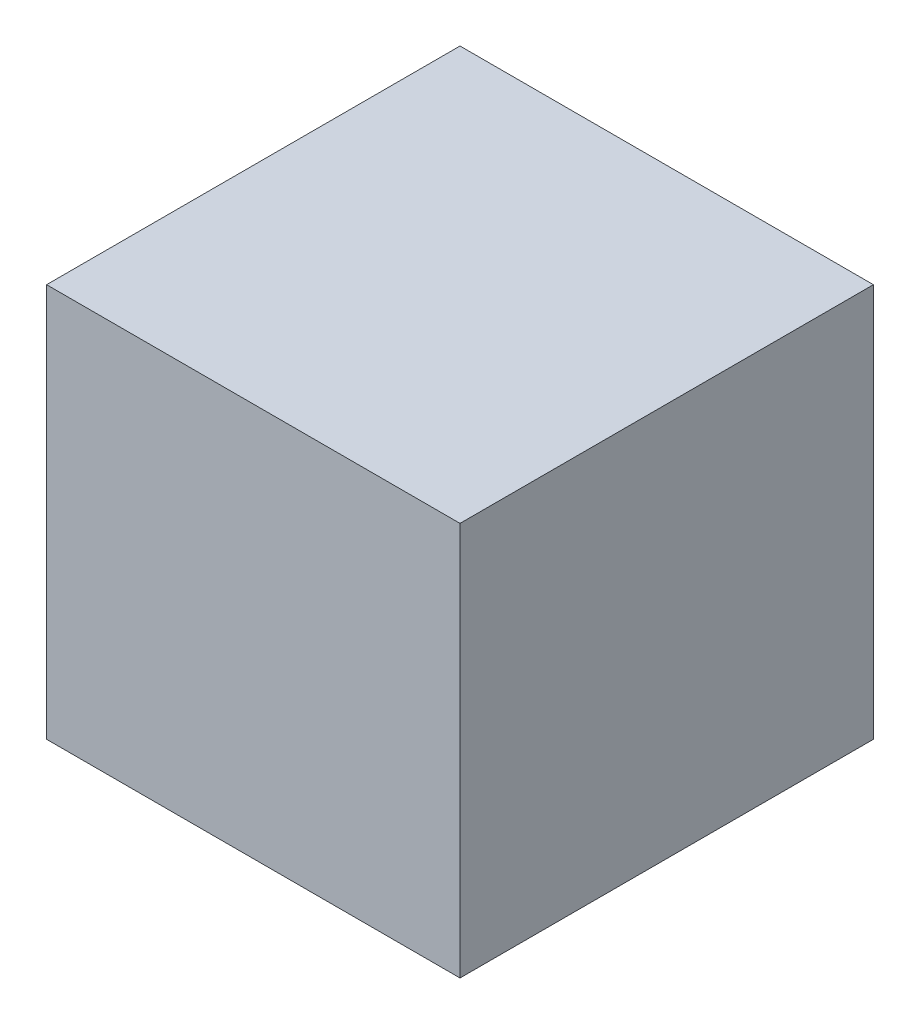
ISO-10303-21;
HEADER;
FILE_DESCRIPTION(('STEP AP214'),'2;1');
FILE_NAME('part.step','',(''),(''),'','','');
FILE_SCHEMA(('AUTOMOTIVE_DESIGN { 1 0 10303 214 1 1 1 1 }'));
ENDSEC;
DATA;
#1=APPLICATION_CONTEXT('core data for automotive mechanical design processes');
#2=APPLICATION_PROTOCOL_DEFINITION('international standard','automotive_design',2000,#1);
#3=PRODUCT_CONTEXT('',#1,'mechanical');
#4=PRODUCT('Part','Part','',(#3));
#5=PRODUCT_RELATED_PRODUCT_CATEGORY('part','',(#4));
#6=PRODUCT_DEFINITION_FORMATION('','',#4);
#7=PRODUCT_DEFINITION_CONTEXT('part definition',#1,'design');
#8=PRODUCT_DEFINITION('design','',#6,#7);
#9=PRODUCT_DEFINITION_SHAPE('','',#8);
#10=(LENGTH_UNIT() NAMED_UNIT(*) SI_UNIT(.MILLI.,.METRE.));
#11=(NAMED_UNIT(*) PLANE_ANGLE_UNIT() SI_UNIT($,.RADIAN.));
#12=(NAMED_UNIT(*) SI_UNIT($,.STERADIAN.) SOLID_ANGLE_UNIT());
#13=UNCERTAINTY_MEASURE_WITH_UNIT(LENGTH_MEASURE(1.E-05),#10,'distance_accuracy_value','');
#14=(GEOMETRIC_REPRESENTATION_CONTEXT(3) GLOBAL_UNCERTAINTY_ASSIGNED_CONTEXT((#13)) GLOBAL_UNIT_ASSIGNED_CONTEXT((#10,
#11,#12)) REPRESENTATION_CONTEXT('',''));
#15=CARTESIAN_POINT('',(0.,0.,0.));
#16=DIRECTION('',(0.,0.,1.));
#17=DIRECTION('',(1.,0.,0.));
#18=AXIS2_PLACEMENT_3D('',#15,#16,#17);
#19=CARTESIAN_POINT('',(0.,40.,0.));
#20=DIRECTION('',(1.,0.,0.));
#21=DIRECTION('',(0.,0.,-1.));
#22=AXIS2_PLACEMENT_3D('',#19,#20,#21);
#23=PLANE('',#22);
#24=DIRECTION('',(0.,0.,1.));
#25=VECTOR('',#24,1.);
#26=CARTESIAN_POINT('',(0.,0.,0.));
#27=LINE('',#26,#25);
#28=CARTESIAN_POINT('',(0.,0.,-42.));
#29=VERTEX_POINT('',#28);
#30=CARTESIAN_POINT('',(0.,0.,0.));
#31=VERTEX_POINT('',#30);
#32=EDGE_CURVE('E113',#29,#31,#27,.T.);
#33=ORIENTED_EDGE('',*,*,#32,.T.);
#34=DIRECTION('',(0.,-1.,0.));
#35=VECTOR('',#34,1.);
#36=CARTESIAN_POINT('',(0.,40.,0.));
#37=LINE('',#36,#35);
#38=CARTESIAN_POINT('',(0.,40.,0.));
#39=VERTEX_POINT('',#38);
#40=EDGE_CURVE('E11',#39,#31,#37,.T.);
#41=ORIENTED_EDGE('',*,*,#40,.F.);
#42=DIRECTION('',(0.,0.,1.));
#43=VECTOR('',#42,1.);
#44=CARTESIAN_POINT('',(0.,40.,0.));
#45=LINE('',#44,#43);
#46=CARTESIAN_POINT('',(0.,40.,-42.));
#47=VERTEX_POINT('',#46);
#48=EDGE_CURVE('E97',#47,#39,#45,.T.);
#49=ORIENTED_EDGE('',*,*,#48,.F.);
#50=DIRECTION('',(0.,-1.,0.));
#51=VECTOR('',#50,1.);
#52=CARTESIAN_POINT('',(0.,40.,-42.));
#53=LINE('',#52,#51);
#54=EDGE_CURVE('E109',#47,#29,#53,.T.);
#55=ORIENTED_EDGE('',*,*,#54,.T.);
#56=EDGE_LOOP('',(#33,#41,#49,#55));
#57=FACE_BOUND('',#56,.T.);
#58=ADVANCED_FACE('F45',(#57),#23,.F.);
#59=CARTESIAN_POINT('',(0.,40.,0.));
#60=DIRECTION('',(0.,0.,-1.));
#61=DIRECTION('',(-1.,0.,0.));
#62=AXIS2_PLACEMENT_3D('',#59,#60,#61);
#63=PLANE('',#62);
#64=DIRECTION('',(1.,0.,0.));
#65=VECTOR('',#64,1.);
#66=CARTESIAN_POINT('',(0.,0.,0.));
#67=LINE('',#66,#65);
#68=CARTESIAN_POINT('',(42.,0.,0.));
#69=VERTEX_POINT('',#68);
#70=EDGE_CURVE('E102',#31,#69,#67,.T.);
#71=ORIENTED_EDGE('',*,*,#70,.T.);
#72=DIRECTION('',(0.,-1.,0.));
#73=VECTOR('',#72,1.);
#74=CARTESIAN_POINT('',(42.,40.,0.));
#75=LINE('',#74,#73);
#76=CARTESIAN_POINT('',(42.,40.,0.));
#77=VERTEX_POINT('',#76);
#78=EDGE_CURVE('E54',#77,#69,#75,.T.);
#79=ORIENTED_EDGE('',*,*,#78,.F.);
#80=DIRECTION('',(1.,0.,0.));
#81=VECTOR('',#80,1.);
#82=CARTESIAN_POINT('',(0.,40.,0.));
#83=LINE('',#82,#81);
#84=EDGE_CURVE('E92',#39,#77,#83,.T.);
#85=ORIENTED_EDGE('',*,*,#84,.F.);
#86=ORIENTED_EDGE('',*,*,#40,.T.);
#87=EDGE_LOOP('',(#71,#79,#85,#86));
#88=FACE_BOUND('',#87,.T.);
#89=ADVANCED_FACE('F101',(#88),#63,.F.);
#90=CARTESIAN_POINT('',(42.,40.,0.));
#91=DIRECTION('',(-1.,0.,0.));
#92=DIRECTION('',(0.,0.,1.));
#93=AXIS2_PLACEMENT_3D('',#90,#91,#92);
#94=PLANE('',#93);
#95=DIRECTION('',(0.,0.,-1.));
#96=VECTOR('',#95,1.);
#97=CARTESIAN_POINT('',(42.,0.,0.));
#98=LINE('',#97,#96);
#99=CARTESIAN_POINT('',(42.,0.,-42.));
#100=VERTEX_POINT('',#99);
#101=EDGE_CURVE('E79',#69,#100,#98,.T.);
#102=ORIENTED_EDGE('',*,*,#101,.T.);
#103=DIRECTION('',(0.,-1.,0.));
#104=VECTOR('',#103,1.);
#105=CARTESIAN_POINT('',(42.,40.,-42.));
#106=LINE('',#105,#104);
#107=CARTESIAN_POINT('',(42.,40.,-42.));
#108=VERTEX_POINT('',#107);
#109=EDGE_CURVE('E104',#108,#100,#106,.T.);
#110=ORIENTED_EDGE('',*,*,#109,.F.);
#111=DIRECTION('',(0.,0.,-1.));
#112=VECTOR('',#111,1.);
#113=CARTESIAN_POINT('',(42.,40.,0.));
#114=LINE('',#113,#112);
#115=EDGE_CURVE('E95',#77,#108,#114,.T.);
#116=ORIENTED_EDGE('',*,*,#115,.F.);
#117=ORIENTED_EDGE('',*,*,#78,.T.);
#118=EDGE_LOOP('',(#102,#110,#116,#117));
#119=FACE_BOUND('',#118,.T.);
#120=ADVANCED_FACE('F105',(#119),#94,.F.);
#121=CARTESIAN_POINT('',(0.,40.,-42.));
#122=DIRECTION('',(0.,0.,1.));
#123=DIRECTION('',(1.,0.,0.));
#124=AXIS2_PLACEMENT_3D('',#121,#122,#123);
#125=PLANE('',#124);
#126=DIRECTION('',(-1.,0.,0.));
#127=VECTOR('',#126,1.);
#128=CARTESIAN_POINT('',(0.,0.,-42.));
#129=LINE('',#128,#127);
#130=EDGE_CURVE('E85',#100,#29,#129,.T.);
#131=ORIENTED_EDGE('',*,*,#130,.T.);
#132=ORIENTED_EDGE('',*,*,#54,.F.);
#133=DIRECTION('',(-1.,0.,0.));
#134=VECTOR('',#133,1.);
#135=CARTESIAN_POINT('',(0.,40.,-42.));
#136=LINE('',#135,#134);
#137=EDGE_CURVE('E62',#108,#47,#136,.T.);
#138=ORIENTED_EDGE('',*,*,#137,.F.);
#139=ORIENTED_EDGE('',*,*,#109,.T.);
#140=EDGE_LOOP('',(#131,#132,#138,#139));
#141=FACE_BOUND('',#140,.T.);
#142=ADVANCED_FACE('F126',(#141),#125,.F.);
#143=CARTESIAN_POINT('',(0.,40.,0.));
#144=DIRECTION('',(0.,-1.,0.));
#145=DIRECTION('',(0.,0.,-1.));
#146=AXIS2_PLACEMENT_3D('',#143,#144,#145);
#147=PLANE('',#146);
#148=ORIENTED_EDGE('',*,*,#48,.T.);
#149=ORIENTED_EDGE('',*,*,#84,.T.);
#150=ORIENTED_EDGE('',*,*,#115,.T.);
#151=ORIENTED_EDGE('',*,*,#137,.T.);
#152=EDGE_LOOP('',(#148,#149,#150,#151));
#153=FACE_BOUND('',#152,.T.);
#154=ADVANCED_FACE('F93',(#153),#147,.F.);
#155=CARTESIAN_POINT('',(0.,0.,0.));
#156=DIRECTION('',(0.,-1.,0.));
#157=DIRECTION('',(0.,0.,-1.));
#158=AXIS2_PLACEMENT_3D('',#155,#156,#157);
#159=PLANE('',#158);
#160=ORIENTED_EDGE('',*,*,#32,.F.);
#161=ORIENTED_EDGE('',*,*,#130,.F.);
#162=ORIENTED_EDGE('',*,*,#101,.F.);
#163=ORIENTED_EDGE('',*,*,#70,.F.);
#164=EDGE_LOOP('',(#160,#161,#162,#163));
#165=FACE_BOUND('',#164,.T.);
#166=ADVANCED_FACE('F129',(#165),#159,.T.);
#167=CLOSED_SHELL('',(#58,#89,#120,#142,#154,#166));
#168=MANIFOLD_SOLID_BREP('B2',#167);
#169=ADVANCED_BREP_SHAPE_REPRESENTATION('',(#18,#168),#14);
#170=SHAPE_DEFINITION_REPRESENTATION(#9,#169);
ENDSEC;
END-ISO-10303-21;
